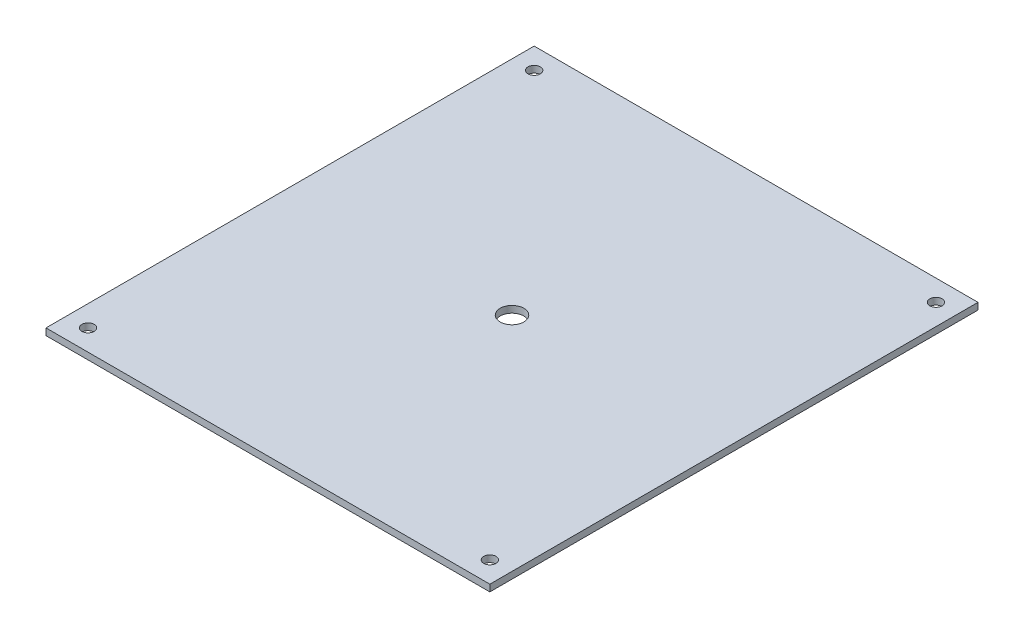
ISO-10303-21;
HEADER;
FILE_DESCRIPTION(('STEP AP214'),'2;1');
FILE_NAME('part.step','',(''),(''),'','','');
FILE_SCHEMA(('AUTOMOTIVE_DESIGN { 1 0 10303 214 1 1 1 1 }'));
ENDSEC;
DATA;
#1=APPLICATION_CONTEXT('core data for automotive mechanical design processes');
#2=APPLICATION_PROTOCOL_DEFINITION('international standard','automotive_design',2000,#1);
#3=PRODUCT_CONTEXT('',#1,'mechanical');
#4=PRODUCT('Part','Part','',(#3));
#5=PRODUCT_RELATED_PRODUCT_CATEGORY('part','',(#4));
#6=PRODUCT_DEFINITION_FORMATION('','',#4);
#7=PRODUCT_DEFINITION_CONTEXT('part definition',#1,'design');
#8=PRODUCT_DEFINITION('design','',#6,#7);
#9=PRODUCT_DEFINITION_SHAPE('','',#8);
#10=(LENGTH_UNIT() NAMED_UNIT(*) SI_UNIT(.MILLI.,.METRE.));
#11=(NAMED_UNIT(*) PLANE_ANGLE_UNIT() SI_UNIT($,.RADIAN.));
#12=(NAMED_UNIT(*) SI_UNIT($,.STERADIAN.) SOLID_ANGLE_UNIT());
#13=UNCERTAINTY_MEASURE_WITH_UNIT(LENGTH_MEASURE(1.E-05),#10,'distance_accuracy_value','');
#14=(GEOMETRIC_REPRESENTATION_CONTEXT(3) GLOBAL_UNCERTAINTY_ASSIGNED_CONTEXT((#13)) GLOBAL_UNIT_ASSIGNED_CONTEXT((#10,
#11,#12)) REPRESENTATION_CONTEXT('',''));
#15=CARTESIAN_POINT('',(0.,0.,0.));
#16=DIRECTION('',(0.,0.,1.));
#17=DIRECTION('',(1.,0.,0.));
#18=AXIS2_PLACEMENT_3D('',#15,#16,#17);
#19=CARTESIAN_POINT('',(-70.15,2.13,77.15));
#20=DIRECTION('',(1.,0.,0.));
#21=DIRECTION('',(0.,0.,-1.));
#22=AXIS2_PLACEMENT_3D('',#19,#20,#21);
#23=PLANE('',#22);
#24=DIRECTION('',(0.,0.,1.));
#25=VECTOR('',#24,1.);
#26=CARTESIAN_POINT('',(-70.15,0.,77.15));
#27=LINE('',#26,#25);
#28=CARTESIAN_POINT('',(-70.15,0.,-77.15));
#29=VERTEX_POINT('',#28);
#30=CARTESIAN_POINT('',(-70.15,0.,77.15));
#31=VERTEX_POINT('',#30);
#32=EDGE_CURVE('E97',#29,#31,#27,.T.);
#33=ORIENTED_EDGE('',*,*,#32,.T.);
#34=DIRECTION('',(0.,-1.,0.));
#35=VECTOR('',#34,1.);
#36=CARTESIAN_POINT('',(-70.15,2.13,77.15));
#37=LINE('',#36,#35);
#38=CARTESIAN_POINT('',(-70.15,2.13,77.15));
#39=VERTEX_POINT('',#38);
#40=EDGE_CURVE('E11',#39,#31,#37,.T.);
#41=ORIENTED_EDGE('',*,*,#40,.F.);
#42=DIRECTION('',(0.,0.,1.));
#43=VECTOR('',#42,1.);
#44=CARTESIAN_POINT('',(-70.15,2.13,77.15));
#45=LINE('',#44,#43);
#46=CARTESIAN_POINT('',(-70.15,2.13,-77.15));
#47=VERTEX_POINT('',#46);
#48=EDGE_CURVE('E85',#47,#39,#45,.T.);
#49=ORIENTED_EDGE('',*,*,#48,.F.);
#50=DIRECTION('',(0.,-1.,0.));
#51=VECTOR('',#50,1.);
#52=CARTESIAN_POINT('',(-70.15,2.13,-77.15));
#53=LINE('',#52,#51);
#54=EDGE_CURVE('E93',#47,#29,#53,.T.);
#55=ORIENTED_EDGE('',*,*,#54,.T.);
#56=EDGE_LOOP('',(#33,#41,#49,#55));
#57=FACE_BOUND('',#56,.T.);
#58=ADVANCED_FACE('F34',(#57),#23,.F.);
#59=CARTESIAN_POINT('',(70.15,2.13,77.15));
#60=DIRECTION('',(0.,0.,-1.));
#61=DIRECTION('',(-1.,0.,0.));
#62=AXIS2_PLACEMENT_3D('',#59,#60,#61);
#63=PLANE('',#62);
#64=DIRECTION('',(1.,0.,0.));
#65=VECTOR('',#64,1.);
#66=CARTESIAN_POINT('',(70.15,0.,77.15));
#67=LINE('',#66,#65);
#68=CARTESIAN_POINT('',(70.15,0.,77.15));
#69=VERTEX_POINT('',#68);
#70=EDGE_CURVE('E89',#31,#69,#67,.T.);
#71=ORIENTED_EDGE('',*,*,#70,.T.);
#72=DIRECTION('',(0.,-1.,0.));
#73=VECTOR('',#72,1.);
#74=CARTESIAN_POINT('',(70.15,2.13,77.15));
#75=LINE('',#74,#73);
#76=CARTESIAN_POINT('',(70.15,2.13,77.15));
#77=VERTEX_POINT('',#76);
#78=EDGE_CURVE('E42',#77,#69,#75,.T.);
#79=ORIENTED_EDGE('',*,*,#78,.F.);
#80=DIRECTION('',(1.,0.,0.));
#81=VECTOR('',#80,1.);
#82=CARTESIAN_POINT('',(70.15,2.13,77.15));
#83=LINE('',#82,#81);
#84=EDGE_CURVE('E80',#39,#77,#83,.T.);
#85=ORIENTED_EDGE('',*,*,#84,.F.);
#86=ORIENTED_EDGE('',*,*,#40,.T.);
#87=EDGE_LOOP('',(#71,#79,#85,#86));
#88=FACE_BOUND('',#87,.T.);
#89=ADVANCED_FACE('F88',(#88),#63,.F.);
#90=CARTESIAN_POINT('',(70.15,2.13,77.15));
#91=DIRECTION('',(-1.,0.,0.));
#92=DIRECTION('',(0.,0.,1.));
#93=AXIS2_PLACEMENT_3D('',#90,#91,#92);
#94=PLANE('',#93);
#95=DIRECTION('',(0.,0.,-1.));
#96=VECTOR('',#95,1.);
#97=CARTESIAN_POINT('',(70.15,0.,77.15));
#98=LINE('',#97,#96);
#99=CARTESIAN_POINT('',(70.15,0.,-77.15));
#100=VERTEX_POINT('',#99);
#101=EDGE_CURVE('E67',#69,#100,#98,.T.);
#102=ORIENTED_EDGE('',*,*,#101,.T.);
#103=DIRECTION('',(0.,-1.,0.));
#104=VECTOR('',#103,1.);
#105=CARTESIAN_POINT('',(70.15,2.13,-77.15));
#106=LINE('',#105,#104);
#107=CARTESIAN_POINT('',(70.15,2.13,-77.15));
#108=VERTEX_POINT('',#107);
#109=EDGE_CURVE('E90',#108,#100,#106,.T.);
#110=ORIENTED_EDGE('',*,*,#109,.F.);
#111=DIRECTION('',(0.,0.,-1.));
#112=VECTOR('',#111,1.);
#113=CARTESIAN_POINT('',(70.15,2.13,77.15));
#114=LINE('',#113,#112);
#115=EDGE_CURVE('E83',#77,#108,#114,.T.);
#116=ORIENTED_EDGE('',*,*,#115,.F.);
#117=ORIENTED_EDGE('',*,*,#78,.T.);
#118=EDGE_LOOP('',(#102,#110,#116,#117));
#119=FACE_BOUND('',#118,.T.);
#120=ADVANCED_FACE('F91',(#119),#94,.F.);
#121=CARTESIAN_POINT('',(70.15,2.13,-77.15));
#122=DIRECTION('',(0.,0.,1.));
#123=DIRECTION('',(1.,0.,0.));
#124=AXIS2_PLACEMENT_3D('',#121,#122,#123);
#125=PLANE('',#124);
#126=DIRECTION('',(-1.,0.,0.));
#127=VECTOR('',#126,1.);
#128=CARTESIAN_POINT('',(70.15,0.,-77.15));
#129=LINE('',#128,#127);
#130=EDGE_CURVE('E73',#100,#29,#129,.T.);
#131=ORIENTED_EDGE('',*,*,#130,.T.);
#132=ORIENTED_EDGE('',*,*,#54,.F.);
#133=DIRECTION('',(-1.,0.,0.));
#134=VECTOR('',#133,1.);
#135=CARTESIAN_POINT('',(70.15,2.13,-77.15));
#136=LINE('',#135,#134);
#137=EDGE_CURVE('E50',#108,#47,#136,.T.);
#138=ORIENTED_EDGE('',*,*,#137,.F.);
#139=ORIENTED_EDGE('',*,*,#109,.T.);
#140=EDGE_LOOP('',(#131,#132,#138,#139));
#141=FACE_BOUND('',#140,.T.);
#142=ADVANCED_FACE('F105',(#141),#125,.F.);
#143=CARTESIAN_POINT('',(0.,2.13,0.));
#144=DIRECTION('',(0.,1.,0.));
#145=DIRECTION('',(0.,0.,1.));
#146=AXIS2_PLACEMENT_3D('',#143,#144,#145);
#147=PLANE('',#146);
#148=CARTESIAN_POINT('',(0.,2.13,0.));
#149=DIRECTION('',(0.,1.,0.));
#150=DIRECTION('',(0.,0.,1.));
#151=AXIS2_PLACEMENT_3D('',#148,#149,#150);
#152=CIRCLE('',#151,3.75);
#153=CARTESIAN_POINT('',(0.,2.13,3.75));
#154=VERTEX_POINT('',#153);
#155=EDGE_CURVE('E130',#154,#154,#152,.F.);
#156=ORIENTED_EDGE('',*,*,#155,.T.);
#157=EDGE_LOOP('',(#156));
#158=FACE_BOUND('',#157,.T.);
#159=CARTESIAN_POINT('',(-63.5,2.13,-70.5));
#160=DIRECTION('',(0.,1.,0.));
#161=DIRECTION('',(0.,0.,1.));
#162=AXIS2_PLACEMENT_3D('',#159,#160,#161);
#163=CIRCLE('',#162,1.94);
#164=CARTESIAN_POINT('',(-63.5,2.13,-68.56));
#165=VERTEX_POINT('',#164);
#166=EDGE_CURVE('E116',#165,#165,#163,.F.);
#167=ORIENTED_EDGE('',*,*,#166,.T.);
#168=EDGE_LOOP('',(#167));
#169=FACE_BOUND('',#168,.T.);
#170=CARTESIAN_POINT('',(63.5,2.13,70.5));
#171=DIRECTION('',(0.,1.,0.));
#172=DIRECTION('',(0.,0.,1.));
#173=AXIS2_PLACEMENT_3D('',#170,#171,#172);
#174=CIRCLE('',#173,1.94);
#175=CARTESIAN_POINT('',(63.5,2.13,72.44));
#176=VERTEX_POINT('',#175);
#177=EDGE_CURVE('E119',#176,#176,#174,.F.);
#178=ORIENTED_EDGE('',*,*,#177,.T.);
#179=EDGE_LOOP('',(#178));
#180=FACE_BOUND('',#179,.T.);
#181=CARTESIAN_POINT('',(63.5,2.13,-70.5));
#182=DIRECTION('',(0.,1.,0.));
#183=DIRECTION('',(0.,0.,1.));
#184=AXIS2_PLACEMENT_3D('',#181,#182,#183);
#185=CIRCLE('',#184,1.94);
#186=CARTESIAN_POINT('',(63.5,2.13,-68.56));
#187=VERTEX_POINT('',#186);
#188=EDGE_CURVE('E122',#187,#187,#185,.F.);
#189=ORIENTED_EDGE('',*,*,#188,.T.);
#190=EDGE_LOOP('',(#189));
#191=FACE_BOUND('',#190,.T.);
#192=CARTESIAN_POINT('',(-63.5,2.13,70.5));
#193=DIRECTION('',(0.,1.,0.));
#194=DIRECTION('',(0.,0.,1.));
#195=AXIS2_PLACEMENT_3D('',#192,#193,#194);
#196=CIRCLE('',#195,1.94);
#197=CARTESIAN_POINT('',(-63.5,2.13,72.44));
#198=VERTEX_POINT('',#197);
#199=EDGE_CURVE('E100',#198,#198,#196,.F.);
#200=ORIENTED_EDGE('',*,*,#199,.T.);
#201=EDGE_LOOP('',(#200));
#202=FACE_BOUND('',#201,.T.);
#203=ORIENTED_EDGE('',*,*,#48,.T.);
#204=ORIENTED_EDGE('',*,*,#84,.T.);
#205=ORIENTED_EDGE('',*,*,#115,.T.);
#206=ORIENTED_EDGE('',*,*,#137,.T.);
#207=EDGE_LOOP('',(#203,#204,#205,#206));
#208=FACE_BOUND('',#207,.T.);
#209=ADVANCED_FACE('F81',(#158,#169,#180,#191,#202,#208),#147,.T.);
#210=CARTESIAN_POINT('',(0.,0.,0.));
#211=DIRECTION('',(0.,1.,0.));
#212=DIRECTION('',(0.,0.,1.));
#213=AXIS2_PLACEMENT_3D('',#210,#211,#212);
#214=PLANE('',#213);
#215=CARTESIAN_POINT('',(0.,0.,0.));
#216=DIRECTION('',(0.,1.,0.));
#217=DIRECTION('',(0.,0.,1.));
#218=AXIS2_PLACEMENT_3D('',#215,#216,#217);
#219=CIRCLE('',#218,3.75);
#220=CARTESIAN_POINT('',(0.,0.,3.75));
#221=VERTEX_POINT('',#220);
#222=EDGE_CURVE('E137',#221,#221,#219,.T.);
#223=ORIENTED_EDGE('',*,*,#222,.T.);
#224=EDGE_LOOP('',(#223));
#225=FACE_BOUND('',#224,.T.);
#226=CARTESIAN_POINT('',(-63.5,0.,-70.5));
#227=DIRECTION('',(0.,1.,0.));
#228=DIRECTION('',(0.,0.,1.));
#229=AXIS2_PLACEMENT_3D('',#226,#227,#228);
#230=CIRCLE('',#229,1.94);
#231=CARTESIAN_POINT('',(-63.5,0.,-68.56));
#232=VERTEX_POINT('',#231);
#233=EDGE_CURVE('E125',#232,#232,#230,.T.);
#234=ORIENTED_EDGE('',*,*,#233,.T.);
#235=EDGE_LOOP('',(#234));
#236=FACE_BOUND('',#235,.T.);
#237=CARTESIAN_POINT('',(63.5,0.,70.5));
#238=DIRECTION('',(0.,1.,0.));
#239=DIRECTION('',(0.,0.,1.));
#240=AXIS2_PLACEMENT_3D('',#237,#238,#239);
#241=CIRCLE('',#240,1.94);
#242=CARTESIAN_POINT('',(63.5,0.,72.44));
#243=VERTEX_POINT('',#242);
#244=EDGE_CURVE('E129',#243,#243,#241,.T.);
#245=ORIENTED_EDGE('',*,*,#244,.T.);
#246=EDGE_LOOP('',(#245));
#247=FACE_BOUND('',#246,.T.);
#248=CARTESIAN_POINT('',(63.5,0.,-70.5));
#249=DIRECTION('',(0.,1.,0.));
#250=DIRECTION('',(0.,0.,1.));
#251=AXIS2_PLACEMENT_3D('',#248,#249,#250);
#252=CIRCLE('',#251,1.94);
#253=CARTESIAN_POINT('',(63.5,0.,-68.56));
#254=VERTEX_POINT('',#253);
#255=EDGE_CURVE('E126',#254,#254,#252,.T.);
#256=ORIENTED_EDGE('',*,*,#255,.T.);
#257=EDGE_LOOP('',(#256));
#258=FACE_BOUND('',#257,.T.);
#259=CARTESIAN_POINT('',(-63.5,0.,70.5));
#260=DIRECTION('',(0.,1.,0.));
#261=DIRECTION('',(0.,0.,1.));
#262=AXIS2_PLACEMENT_3D('',#259,#260,#261);
#263=CIRCLE('',#262,1.94);
#264=CARTESIAN_POINT('',(-63.5,0.,72.44));
#265=VERTEX_POINT('',#264);
#266=EDGE_CURVE('E113',#265,#265,#263,.T.);
#267=ORIENTED_EDGE('',*,*,#266,.T.);
#268=EDGE_LOOP('',(#267));
#269=FACE_BOUND('',#268,.T.);
#270=ORIENTED_EDGE('',*,*,#32,.F.);
#271=ORIENTED_EDGE('',*,*,#130,.F.);
#272=ORIENTED_EDGE('',*,*,#101,.F.);
#273=ORIENTED_EDGE('',*,*,#70,.F.);
#274=EDGE_LOOP('',(#270,#271,#272,#273));
#275=FACE_BOUND('',#274,.T.);
#276=ADVANCED_FACE('F108',(#225,#236,#247,#258,#269,#275),#214,.F.);
#277=CARTESIAN_POINT('',(-63.5,31.13,70.5));
#278=DIRECTION('',(0.,-1.,0.));
#279=DIRECTION('',(0.,0.,-1.));
#280=AXIS2_PLACEMENT_3D('',#277,#278,#279);
#281=CYLINDRICAL_SURFACE('',#280,1.94);
#282=ORIENTED_EDGE('',*,*,#199,.F.);
#283=EDGE_LOOP('',(#282));
#284=FACE_BOUND('',#283,.T.);
#285=ORIENTED_EDGE('',*,*,#266,.F.);
#286=EDGE_LOOP('',(#285));
#287=FACE_BOUND('',#286,.T.);
#288=ADVANCED_FACE('F168',(#284,#287),#281,.F.);
#289=CARTESIAN_POINT('',(63.5,31.13,-70.5));
#290=DIRECTION('',(0.,-1.,0.));
#291=DIRECTION('',(0.,0.,-1.));
#292=AXIS2_PLACEMENT_3D('',#289,#290,#291);
#293=CYLINDRICAL_SURFACE('',#292,1.94);
#294=ORIENTED_EDGE('',*,*,#188,.F.);
#295=EDGE_LOOP('',(#294));
#296=FACE_BOUND('',#295,.T.);
#297=ORIENTED_EDGE('',*,*,#255,.F.);
#298=EDGE_LOOP('',(#297));
#299=FACE_BOUND('',#298,.T.);
#300=ADVANCED_FACE('F174',(#296,#299),#293,.F.);
#301=CARTESIAN_POINT('',(63.5,31.13,70.5));
#302=DIRECTION('',(0.,-1.,0.));
#303=DIRECTION('',(0.,0.,-1.));
#304=AXIS2_PLACEMENT_3D('',#301,#302,#303);
#305=CYLINDRICAL_SURFACE('',#304,1.94);
#306=ORIENTED_EDGE('',*,*,#177,.F.);
#307=EDGE_LOOP('',(#306));
#308=FACE_BOUND('',#307,.T.);
#309=ORIENTED_EDGE('',*,*,#244,.F.);
#310=EDGE_LOOP('',(#309));
#311=FACE_BOUND('',#310,.T.);
#312=ADVANCED_FACE('F151',(#308,#311),#305,.F.);
#313=CARTESIAN_POINT('',(-63.5,31.13,-70.5));
#314=DIRECTION('',(0.,-1.,0.));
#315=DIRECTION('',(0.,0.,-1.));
#316=AXIS2_PLACEMENT_3D('',#313,#314,#315);
#317=CYLINDRICAL_SURFACE('',#316,1.94);
#318=ORIENTED_EDGE('',*,*,#166,.F.);
#319=EDGE_LOOP('',(#318));
#320=FACE_BOUND('',#319,.T.);
#321=ORIENTED_EDGE('',*,*,#233,.F.);
#322=EDGE_LOOP('',(#321));
#323=FACE_BOUND('',#322,.T.);
#324=ADVANCED_FACE('F145',(#320,#323),#317,.F.);
#325=CARTESIAN_POINT('',(0.,20.,0.));
#326=DIRECTION('',(0.,-1.,0.));
#327=DIRECTION('',(0.,0.,-1.));
#328=AXIS2_PLACEMENT_3D('',#325,#326,#327);
#329=CYLINDRICAL_SURFACE('',#328,3.75);
#330=ORIENTED_EDGE('',*,*,#155,.F.);
#331=EDGE_LOOP('',(#330));
#332=FACE_BOUND('',#331,.T.);
#333=ORIENTED_EDGE('',*,*,#222,.F.);
#334=EDGE_LOOP('',(#333));
#335=FACE_BOUND('',#334,.T.);
#336=ADVANCED_FACE('F143',(#332,#335),#329,.F.);
#337=CLOSED_SHELL('',(#58,#89,#120,#142,#209,#276,#288,#300,#312,#324,#336));
#338=MANIFOLD_SOLID_BREP('B2',#337);
#339=ADVANCED_BREP_SHAPE_REPRESENTATION('',(#18,#338),#14);
#340=SHAPE_DEFINITION_REPRESENTATION(#9,#339);
ENDSEC;
END-ISO-10303-21;
